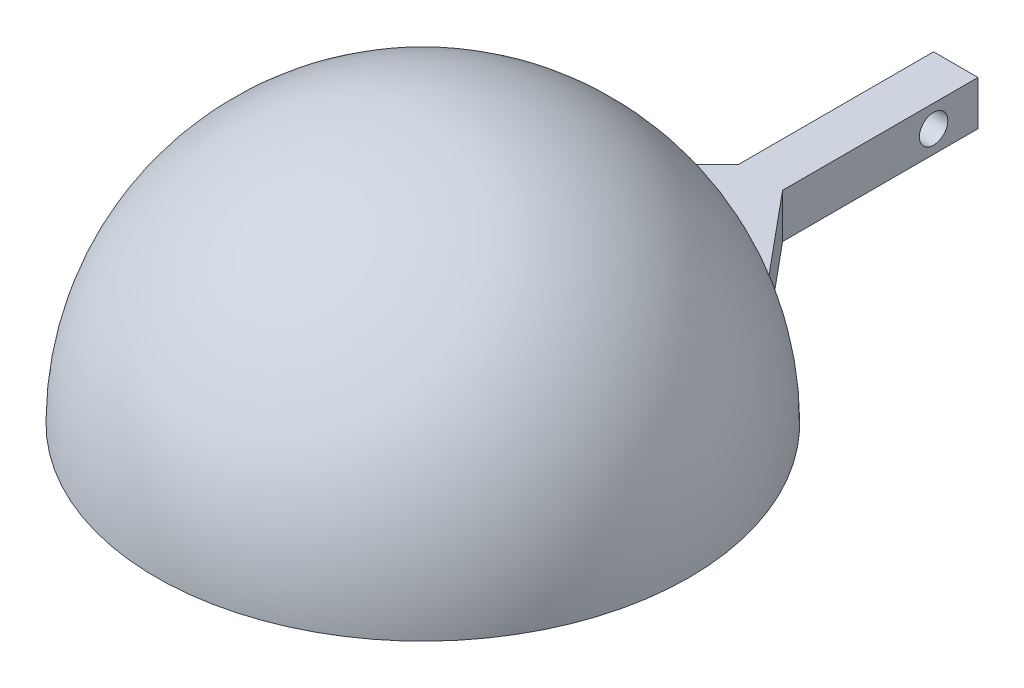
ISO-10303-21;
HEADER;
FILE_DESCRIPTION(('STEP AP214'),'2;1');
FILE_NAME('part.step','',(''),(''),'','','');
FILE_SCHEMA(('AUTOMOTIVE_DESIGN { 1 0 10303 214 1 1 1 1 }'));
ENDSEC;
DATA;
#1=APPLICATION_CONTEXT('core data for automotive mechanical design processes');
#2=APPLICATION_PROTOCOL_DEFINITION('international standard','automotive_design',2000,#1);
#3=PRODUCT_CONTEXT('',#1,'mechanical');
#4=PRODUCT('Part','Part','',(#3));
#5=PRODUCT_RELATED_PRODUCT_CATEGORY('part','',(#4));
#6=PRODUCT_DEFINITION_FORMATION('','',#4);
#7=PRODUCT_DEFINITION_CONTEXT('part definition',#1,'design');
#8=PRODUCT_DEFINITION('design','',#6,#7);
#9=PRODUCT_DEFINITION_SHAPE('','',#8);
#10=(LENGTH_UNIT() NAMED_UNIT(*) SI_UNIT(.MILLI.,.METRE.));
#11=(NAMED_UNIT(*) PLANE_ANGLE_UNIT() SI_UNIT($,.RADIAN.));
#12=(NAMED_UNIT(*) SI_UNIT($,.STERADIAN.) SOLID_ANGLE_UNIT());
#13=UNCERTAINTY_MEASURE_WITH_UNIT(LENGTH_MEASURE(1.E-05),#10,'distance_accuracy_value','');
#14=(GEOMETRIC_REPRESENTATION_CONTEXT(3) GLOBAL_UNCERTAINTY_ASSIGNED_CONTEXT((#13)) GLOBAL_UNIT_ASSIGNED_CONTEXT((#10,
#11,#12)) REPRESENTATION_CONTEXT('',''));
#15=CARTESIAN_POINT('',(0.,0.,0.));
#16=DIRECTION('',(0.,0.,1.));
#17=DIRECTION('',(1.,0.,0.));
#18=AXIS2_PLACEMENT_3D('',#15,#16,#17);
#19=CARTESIAN_POINT('',(0.,0.,0.));
#20=DIRECTION('',(0.,-1.,0.));
#21=DIRECTION('',(1.,0.,0.));
#22=AXIS2_PLACEMENT_3D('',#19,#20,#21);
#23=SPHERICAL_SURFACE('',#22,30.);
#24=CARTESIAN_POINT('',(0.,5.,0.));
#25=DIRECTION('',(0.,-1.,0.));
#26=DIRECTION('',(0.,0.,-1.));
#27=AXIS2_PLACEMENT_3D('',#24,#25,#26);
#28=CIRCLE('',#27,29.5803989154981);
#29=CARTESIAN_POINT('',(11.4025555446812,5.,-27.2943533913237));
#30=VERTEX_POINT('',#29);
#31=CARTESIAN_POINT('',(-14.2166838766896,5.,-25.9400443243699));
#32=VERTEX_POINT('',#31);
#33=EDGE_CURVE('E11',#30,#32,#28,.F.);
#34=ORIENTED_EDGE('',*,*,#33,.T.);
#35=CARTESIAN_POINT('',(0.,0.,0.));
#36=DIRECTION('',(0.876933553143501,0.,-0.48061163466058));
#37=DIRECTION('',(-0.48061163466058,0.,-0.876933553143501));
#38=AXIS2_PLACEMENT_3D('',#35,#36,#37);
#39=CIRCLE('',#38,30.);
#40=CARTESIAN_POINT('',(-14.4183490398174,0.,-26.308006594305));
#41=VERTEX_POINT('',#40);
#42=EDGE_CURVE('E137',#32,#41,#39,.F.);
#43=ORIENTED_EDGE('',*,*,#42,.T.);
#44=CARTESIAN_POINT('',(0.,0.,0.));
#45=DIRECTION('',(0.,-1.,0.));
#46=DIRECTION('',(0.,0.,-1.));
#47=AXIS2_PLACEMENT_3D('',#44,#45,#46);
#48=CIRCLE('',#47,30.);
#49=CARTESIAN_POINT('',(10.8372340252813,0.,-27.9741730651915));
#50=VERTEX_POINT('',#49);
#51=EDGE_CURVE('E42',#50,#41,#48,.T.);
#52=ORIENTED_EDGE('',*,*,#51,.F.);
#53=CARTESIAN_POINT('',(20.1593324272442,0.,-16.764010922216));
#54=DIRECTION('',(0.768885498760629,0.,-0.639386494849257));
#55=DIRECTION('',(-0.639386494849257,0.,-0.768885498760629));
#56=AXIS2_PLACEMENT_3D('',#53,#54,#55);
#57=CIRCLE('',#56,14.5797549323603);
#58=EDGE_CURVE('E145',#30,#50,#57,.F.);
#59=ORIENTED_EDGE('',*,*,#58,.F.);
#60=EDGE_LOOP('',(#34,#43,#52,#59));
#61=FACE_BOUND('',#60,.T.);
#62=ADVANCED_FACE('F34',(#61),#23,.T.);
#63=CARTESIAN_POINT('',(29.,0.,0.));
#64=DIRECTION('',(0.,-1.,0.));
#65=DIRECTION('',(0.,0.,-1.));
#66=AXIS2_PLACEMENT_3D('',#63,#64,#65);
#67=PLANE('',#66);
#68=CARTESIAN_POINT('',(0.,0.,0.));
#69=DIRECTION('',(0.,-1.,0.));
#70=DIRECTION('',(0.,0.,-1.));
#71=AXIS2_PLACEMENT_3D('',#68,#69,#70);
#72=CIRCLE('',#71,29.);
#73=CARTESIAN_POINT('',(0.,0.,-29.));
#74=VERTEX_POINT('',#73);
#75=EDGE_CURVE('E147',#74,#74,#72,.T.);
#76=ORIENTED_EDGE('',*,*,#75,.F.);
#77=EDGE_LOOP('',(#76));
#78=FACE_BOUND('',#77,.T.);
#79=ORIENTED_EDGE('',*,*,#51,.T.);
#80=DIRECTION('',(-0.713853106643577,0.,0.700295467738663));
#81=VECTOR('',#80,1.);
#82=CARTESIAN_POINT('',(-20.2225419734574,0.,-20.6140480368922));
#83=LINE('',#82,#81);
#84=CARTESIAN_POINT('',(-2.5,0.,-38.));
#85=VERTEX_POINT('',#84);
#86=EDGE_CURVE('E129',#85,#41,#83,.T.);
#87=ORIENTED_EDGE('',*,*,#86,.F.);
#88=DIRECTION('',(0.,0.,1.));
#89=VECTOR('',#88,1.);
#90=CARTESIAN_POINT('',(-2.50000000000001,0.,0.));
#91=LINE('',#90,#89);
#92=CARTESIAN_POINT('',(-2.5,0.,-60.));
#93=VERTEX_POINT('',#92);
#94=EDGE_CURVE('E107',#93,#85,#91,.T.);
#95=ORIENTED_EDGE('',*,*,#94,.F.);
#96=DIRECTION('',(1.,0.,0.));
#97=VECTOR('',#96,1.);
#98=CARTESIAN_POINT('',(0.,0.,-60.));
#99=LINE('',#98,#97);
#100=CARTESIAN_POINT('',(2.5,0.,-60.));
#101=VERTEX_POINT('',#100);
#102=EDGE_CURVE('E132',#93,#101,#99,.T.);
#103=ORIENTED_EDGE('',*,*,#102,.T.);
#104=DIRECTION('',(0.,0.,1.));
#105=VECTOR('',#104,1.);
#106=CARTESIAN_POINT('',(2.5,0.,0.));
#107=LINE('',#106,#105);
#108=CARTESIAN_POINT('',(2.5,0.,-38.));
#109=VERTEX_POINT('',#108);
#110=EDGE_CURVE('E117',#101,#109,#107,.T.);
#111=ORIENTED_EDGE('',*,*,#110,.T.);
#112=DIRECTION('',(0.639386494849257,0.,0.768885498760629));
#113=VECTOR('',#112,1.);
#114=CARTESIAN_POINT('',(20.1593324272442,0.,-16.764010922216));
#115=LINE('',#114,#113);
#116=EDGE_CURVE('E49',#109,#50,#115,.T.);
#117=ORIENTED_EDGE('',*,*,#116,.T.);
#118=EDGE_LOOP('',(#79,#87,#95,#103,#111,#117));
#119=FACE_BOUND('',#118,.T.);
#120=ADVANCED_FACE('F151',(#78,#119),#67,.T.);
#121=CARTESIAN_POINT('',(0.,0.,0.));
#122=DIRECTION('',(0.,-1.,0.));
#123=DIRECTION('',(1.,0.,0.));
#124=AXIS2_PLACEMENT_3D('',#121,#122,#123);
#125=SPHERICAL_SURFACE('',#124,29.);
#126=ORIENTED_EDGE('',*,*,#75,.T.);
#127=EDGE_LOOP('',(#126));
#128=FACE_BOUND('',#127,.T.);
#129=ADVANCED_FACE('F166',(#128),#125,.F.);
#130=CARTESIAN_POINT('',(-20.2225419734574,5.,-20.6140480368922));
#131=DIRECTION('',(0.700295467738663,0.,0.713853106643577));
#132=DIRECTION('',(0.713853106643577,0.,-0.700295467738663));
#133=AXIS2_PLACEMENT_3D('',#130,#131,#132);
#134=PLANE('',#133);
#135=ORIENTED_EDGE('',*,*,#86,.T.);
#136=DIRECTION('',(0.,-1.,0.));
#137=VECTOR('',#136,1.);
#138=CARTESIAN_POINT('',(-14.4183490398174,5.,-26.308006594305));
#139=LINE('',#138,#137);
#140=CARTESIAN_POINT('',(-14.4183490398174,5.,-26.308006594305));
#141=VERTEX_POINT('',#140);
#142=EDGE_CURVE('E115',#141,#41,#139,.T.);
#143=ORIENTED_EDGE('',*,*,#142,.F.);
#144=DIRECTION('',(-0.713853106643577,0.,0.700295467738663));
#145=VECTOR('',#144,1.);
#146=CARTESIAN_POINT('',(-20.2225419734574,5.,-20.6140480368922));
#147=LINE('',#146,#145);
#148=CARTESIAN_POINT('',(-2.5,5.,-38.));
#149=VERTEX_POINT('',#148);
#150=EDGE_CURVE('E96',#149,#141,#147,.T.);
#151=ORIENTED_EDGE('',*,*,#150,.F.);
#152=DIRECTION('',(0.,-1.,0.));
#153=VECTOR('',#152,1.);
#154=CARTESIAN_POINT('',(-2.5,5.,-38.));
#155=LINE('',#154,#153);
#156=EDGE_CURVE('E104',#149,#85,#155,.T.);
#157=ORIENTED_EDGE('',*,*,#156,.T.);
#158=EDGE_LOOP('',(#135,#143,#151,#157));
#159=FACE_BOUND('',#158,.T.);
#160=ADVANCED_FACE('F114',(#159),#134,.F.);
#161=CARTESIAN_POINT('',(0.,5.,0.));
#162=DIRECTION('',(0.876933553143501,0.,-0.48061163466058));
#163=DIRECTION('',(-0.48061163466058,0.,-0.876933553143501));
#164=AXIS2_PLACEMENT_3D('',#161,#162,#163);
#165=PLANE('',#164);
#166=ORIENTED_EDGE('',*,*,#42,.F.);
#167=DIRECTION('',(0.48061163466058,0.,0.876933553143501));
#168=VECTOR('',#167,1.);
#169=CARTESIAN_POINT('',(0.,5.,0.));
#170=LINE('',#169,#168);
#171=EDGE_CURVE('E112',#141,#32,#170,.T.);
#172=ORIENTED_EDGE('',*,*,#171,.F.);
#173=ORIENTED_EDGE('',*,*,#142,.T.);
#174=EDGE_LOOP('',(#166,#172,#173));
#175=FACE_BOUND('',#174,.T.);
#176=ADVANCED_FACE('F155',(#175),#165,.F.);
#177=CARTESIAN_POINT('',(20.1593324272442,5.,-16.764010922216));
#178=DIRECTION('',(0.768885498760629,0.,-0.639386494849257));
#179=DIRECTION('',(-0.639386494849257,0.,-0.768885498760629));
#180=AXIS2_PLACEMENT_3D('',#177,#178,#179);
#181=PLANE('',#180);
#182=DIRECTION('',(0.639386494849257,0.,0.768885498760629));
#183=VECTOR('',#182,1.);
#184=CARTESIAN_POINT('',(20.1593324272442,5.,-16.764010922216));
#185=LINE('',#184,#183);
#186=CARTESIAN_POINT('',(2.5,5.,-38.));
#187=VERTEX_POINT('',#186);
#188=EDGE_CURVE('E126',#187,#30,#185,.T.);
#189=ORIENTED_EDGE('',*,*,#188,.T.);
#190=ORIENTED_EDGE('',*,*,#58,.T.);
#191=ORIENTED_EDGE('',*,*,#116,.F.);
#192=DIRECTION('',(0.,-1.,0.));
#193=VECTOR('',#192,1.);
#194=CARTESIAN_POINT('',(2.5,5.,-38.));
#195=LINE('',#194,#193);
#196=EDGE_CURVE('E138',#187,#109,#195,.T.);
#197=ORIENTED_EDGE('',*,*,#196,.F.);
#198=EDGE_LOOP('',(#189,#190,#191,#197));
#199=FACE_BOUND('',#198,.T.);
#200=ADVANCED_FACE('F157',(#199),#181,.T.);
#201=CARTESIAN_POINT('',(2.5,5.,0.));
#202=DIRECTION('',(1.,0.,0.));
#203=DIRECTION('',(0.,0.,-1.));
#204=AXIS2_PLACEMENT_3D('',#201,#202,#203);
#205=PLANE('',#204);
#206=CARTESIAN_POINT('',(2.5,2.5,-55.));
#207=DIRECTION('',(1.,0.,0.));
#208=DIRECTION('',(0.,0.,-1.));
#209=AXIS2_PLACEMENT_3D('',#206,#207,#208);
#210=CIRCLE('',#209,1.6);
#211=CARTESIAN_POINT('',(2.5,2.5,-56.6));
#212=VERTEX_POINT('',#211);
#213=EDGE_CURVE('E120',#212,#212,#210,.T.);
#214=ORIENTED_EDGE('',*,*,#213,.F.);
#215=EDGE_LOOP('',(#214));
#216=FACE_BOUND('',#215,.T.);
#217=ORIENTED_EDGE('',*,*,#110,.F.);
#218=DIRECTION('',(0.,-1.,0.));
#219=VECTOR('',#218,1.);
#220=CARTESIAN_POINT('',(2.5,5.,-60.));
#221=LINE('',#220,#219);
#222=CARTESIAN_POINT('',(2.5,5.,-60.));
#223=VERTEX_POINT('',#222);
#224=EDGE_CURVE('E140',#223,#101,#221,.T.);
#225=ORIENTED_EDGE('',*,*,#224,.F.);
#226=DIRECTION('',(0.,0.,1.));
#227=VECTOR('',#226,1.);
#228=CARTESIAN_POINT('',(2.5,5.,0.));
#229=LINE('',#228,#227);
#230=EDGE_CURVE('E123',#223,#187,#229,.T.);
#231=ORIENTED_EDGE('',*,*,#230,.T.);
#232=ORIENTED_EDGE('',*,*,#196,.T.);
#233=EDGE_LOOP('',(#217,#225,#231,#232));
#234=FACE_BOUND('',#233,.T.);
#235=ADVANCED_FACE('F163',(#216,#234),#205,.T.);
#236=CARTESIAN_POINT('',(0.,5.,-60.));
#237=DIRECTION('',(0.,0.,-1.));
#238=DIRECTION('',(-1.,0.,0.));
#239=AXIS2_PLACEMENT_3D('',#236,#237,#238);
#240=PLANE('',#239);
#241=ORIENTED_EDGE('',*,*,#102,.F.);
#242=DIRECTION('',(0.,-1.,0.));
#243=VECTOR('',#242,1.);
#244=CARTESIAN_POINT('',(-2.5,5.,-60.));
#245=LINE('',#244,#243);
#246=CARTESIAN_POINT('',(-2.5,5.,-60.));
#247=VERTEX_POINT('',#246);
#248=EDGE_CURVE('E111',#247,#93,#245,.T.);
#249=ORIENTED_EDGE('',*,*,#248,.F.);
#250=DIRECTION('',(1.,0.,0.));
#251=VECTOR('',#250,1.);
#252=CARTESIAN_POINT('',(0.,5.,-60.));
#253=LINE('',#252,#251);
#254=EDGE_CURVE('E100',#247,#223,#253,.T.);
#255=ORIENTED_EDGE('',*,*,#254,.T.);
#256=ORIENTED_EDGE('',*,*,#224,.T.);
#257=EDGE_LOOP('',(#241,#249,#255,#256));
#258=FACE_BOUND('',#257,.T.);
#259=ADVANCED_FACE('F183',(#258),#240,.T.);
#260=CARTESIAN_POINT('',(-2.50000000000001,5.,0.));
#261=DIRECTION('',(1.,0.,0.));
#262=DIRECTION('',(0.,0.,-1.));
#263=AXIS2_PLACEMENT_3D('',#260,#261,#262);
#264=PLANE('',#263);
#265=CARTESIAN_POINT('',(-2.5,2.5,-55.));
#266=DIRECTION('',(1.,0.,0.));
#267=DIRECTION('',(0.,0.,-1.));
#268=AXIS2_PLACEMENT_3D('',#265,#266,#267);
#269=CIRCLE('',#268,1.6);
#270=CARTESIAN_POINT('',(-2.5,2.5,-56.6));
#271=VERTEX_POINT('',#270);
#272=EDGE_CURVE('E37',#271,#271,#269,.T.);
#273=ORIENTED_EDGE('',*,*,#272,.T.);
#274=EDGE_LOOP('',(#273));
#275=FACE_BOUND('',#274,.T.);
#276=ORIENTED_EDGE('',*,*,#94,.T.);
#277=ORIENTED_EDGE('',*,*,#156,.F.);
#278=DIRECTION('',(0.,0.,1.));
#279=VECTOR('',#278,1.);
#280=CARTESIAN_POINT('',(-2.50000000000001,5.,0.));
#281=LINE('',#280,#279);
#282=EDGE_CURVE('E92',#247,#149,#281,.T.);
#283=ORIENTED_EDGE('',*,*,#282,.F.);
#284=ORIENTED_EDGE('',*,*,#248,.T.);
#285=EDGE_LOOP('',(#276,#277,#283,#284));
#286=FACE_BOUND('',#285,.T.);
#287=ADVANCED_FACE('F105',(#275,#286),#264,.F.);
#288=CARTESIAN_POINT('',(0.,5.,0.));
#289=DIRECTION('',(0.,-1.,0.));
#290=DIRECTION('',(0.,0.,-1.));
#291=AXIS2_PLACEMENT_3D('',#288,#289,#290);
#292=PLANE('',#291);
#293=ORIENTED_EDGE('',*,*,#33,.F.);
#294=ORIENTED_EDGE('',*,*,#188,.F.);
#295=ORIENTED_EDGE('',*,*,#230,.F.);
#296=ORIENTED_EDGE('',*,*,#254,.F.);
#297=ORIENTED_EDGE('',*,*,#282,.T.);
#298=ORIENTED_EDGE('',*,*,#150,.T.);
#299=ORIENTED_EDGE('',*,*,#171,.T.);
#300=EDGE_LOOP('',(#293,#294,#295,#296,#297,#298,#299));
#301=FACE_BOUND('',#300,.T.);
#302=ADVANCED_FACE('F94',(#301),#292,.F.);
#303=CARTESIAN_POINT('',(-30.,2.5,-55.));
#304=DIRECTION('',(1.,0.,0.));
#305=DIRECTION('',(0.,0.,-1.));
#306=AXIS2_PLACEMENT_3D('',#303,#304,#305);
#307=CYLINDRICAL_SURFACE('',#306,1.6);
#308=ORIENTED_EDGE('',*,*,#213,.T.);
#309=EDGE_LOOP('',(#308));
#310=FACE_BOUND('',#309,.T.);
#311=ORIENTED_EDGE('',*,*,#272,.F.);
#312=EDGE_LOOP('',(#311));
#313=FACE_BOUND('',#312,.T.);
#314=ADVANCED_FACE('F201',(#310,#313),#307,.F.);
#315=CLOSED_SHELL('',(#62,#120,#129,#160,#176,#200,#235,#259,#287,#302,#314));
#316=MANIFOLD_SOLID_BREP('B2',#315);
#317=ADVANCED_BREP_SHAPE_REPRESENTATION('',(#18,#316),#14);
#318=SHAPE_DEFINITION_REPRESENTATION(#9,#317);
ENDSEC;
END-ISO-10303-21;
